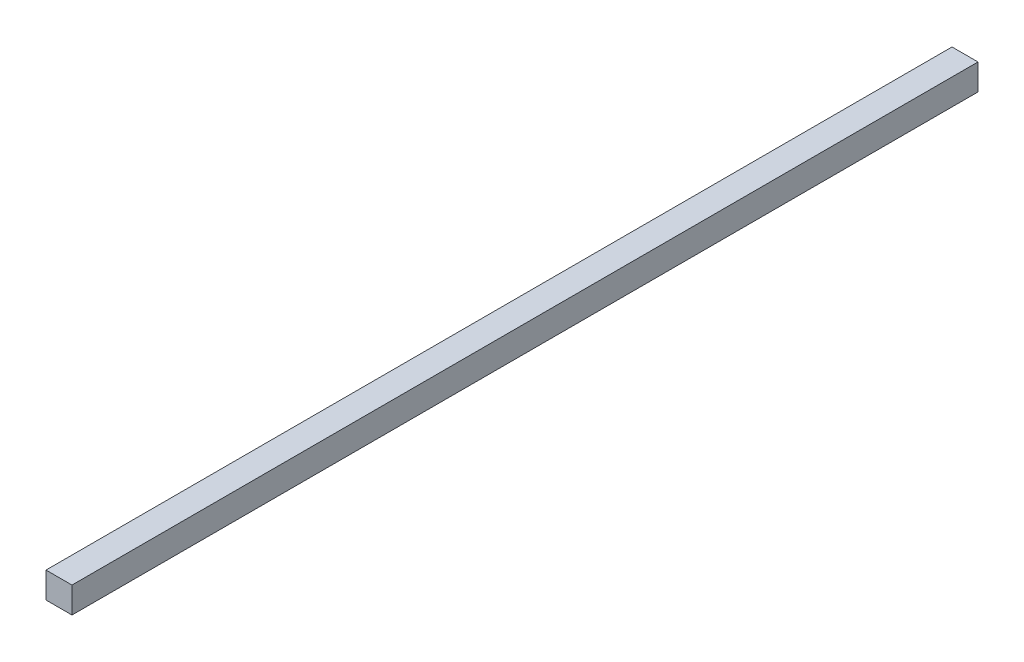
ISO-10303-21;
HEADER;
FILE_DESCRIPTION(('STEP AP214'),'2;1');
FILE_NAME('part.step','',(''),(''),'','','');
FILE_SCHEMA(('AUTOMOTIVE_DESIGN { 1 0 10303 214 1 1 1 1 }'));
ENDSEC;
DATA;
#1=APPLICATION_CONTEXT('core data for automotive mechanical design processes');
#2=APPLICATION_PROTOCOL_DEFINITION('international standard','automotive_design',2000,#1);
#3=PRODUCT_CONTEXT('',#1,'mechanical');
#4=PRODUCT('Part','Part','',(#3));
#5=PRODUCT_RELATED_PRODUCT_CATEGORY('part','',(#4));
#6=PRODUCT_DEFINITION_FORMATION('','',#4);
#7=PRODUCT_DEFINITION_CONTEXT('part definition',#1,'design');
#8=PRODUCT_DEFINITION('design','',#6,#7);
#9=PRODUCT_DEFINITION_SHAPE('','',#8);
#10=(LENGTH_UNIT() NAMED_UNIT(*) SI_UNIT(.MILLI.,.METRE.));
#11=(NAMED_UNIT(*) PLANE_ANGLE_UNIT() SI_UNIT($,.RADIAN.));
#12=(NAMED_UNIT(*) SI_UNIT($,.STERADIAN.) SOLID_ANGLE_UNIT());
#13=UNCERTAINTY_MEASURE_WITH_UNIT(LENGTH_MEASURE(1.E-05),#10,'distance_accuracy_value','');
#14=(GEOMETRIC_REPRESENTATION_CONTEXT(3) GLOBAL_UNCERTAINTY_ASSIGNED_CONTEXT((#13)) GLOBAL_UNIT_ASSIGNED_CONTEXT((#10,
#11,#12)) REPRESENTATION_CONTEXT('',''));
#15=CARTESIAN_POINT('',(0.,0.,0.));
#16=DIRECTION('',(0.,0.,1.));
#17=DIRECTION('',(1.,0.,0.));
#18=AXIS2_PLACEMENT_3D('',#15,#16,#17);
#19=CARTESIAN_POINT('',(1.43379802499999,-1.433798025,100.));
#20=DIRECTION('',(-1.,0.,0.));
#21=DIRECTION('',(0.,0.,1.));
#22=AXIS2_PLACEMENT_3D('',#19,#20,#21);
#23=PLANE('',#22);
#24=DIRECTION('',(0.,1.,0.));
#25=VECTOR('',#24,1.);
#26=CARTESIAN_POINT('',(1.43379802499999,-1.433798025,0.));
#27=LINE('',#26,#25);
#28=CARTESIAN_POINT('',(1.43379802499999,-1.433798025,0.));
#29=VERTEX_POINT('',#28);
#30=CARTESIAN_POINT('',(1.43379802499999,1.433798025,0.));
#31=VERTEX_POINT('',#30);
#32=EDGE_CURVE('E100',#29,#31,#27,.T.);
#33=ORIENTED_EDGE('',*,*,#32,.T.);
#34=DIRECTION('',(0.,0.,-1.));
#35=VECTOR('',#34,1.);
#36=CARTESIAN_POINT('',(1.43379802499999,1.433798025,100.));
#37=LINE('',#36,#35);
#38=CARTESIAN_POINT('',(1.43379802499999,1.433798025,100.));
#39=VERTEX_POINT('',#38);
#40=EDGE_CURVE('E11',#39,#31,#37,.T.);
#41=ORIENTED_EDGE('',*,*,#40,.F.);
#42=DIRECTION('',(0.,1.,0.));
#43=VECTOR('',#42,1.);
#44=CARTESIAN_POINT('',(1.43379802499999,-1.433798025,100.));
#45=LINE('',#44,#43);
#46=CARTESIAN_POINT('',(1.43379802499999,-1.433798025,100.));
#47=VERTEX_POINT('',#46);
#48=EDGE_CURVE('E88',#47,#39,#45,.T.);
#49=ORIENTED_EDGE('',*,*,#48,.F.);
#50=DIRECTION('',(0.,0.,-1.));
#51=VECTOR('',#50,1.);
#52=CARTESIAN_POINT('',(1.43379802499999,-1.433798025,100.));
#53=LINE('',#52,#51);
#54=EDGE_CURVE('E96',#47,#29,#53,.T.);
#55=ORIENTED_EDGE('',*,*,#54,.T.);
#56=EDGE_LOOP('',(#33,#41,#49,#55));
#57=FACE_BOUND('',#56,.T.);
#58=ADVANCED_FACE('F37',(#57),#23,.F.);
#59=CARTESIAN_POINT('',(-1.43379802499999,1.433798025,100.));
#60=DIRECTION('',(0.,-1.,0.));
#61=DIRECTION('',(0.,0.,-1.));
#62=AXIS2_PLACEMENT_3D('',#59,#60,#61);
#63=PLANE('',#62);
#64=DIRECTION('',(-1.,0.,0.));
#65=VECTOR('',#64,1.);
#66=CARTESIAN_POINT('',(-1.43379802499999,1.433798025,0.));
#67=LINE('',#66,#65);
#68=CARTESIAN_POINT('',(-1.43379802499999,1.433798025,0.));
#69=VERTEX_POINT('',#68);
#70=EDGE_CURVE('E92',#31,#69,#67,.T.);
#71=ORIENTED_EDGE('',*,*,#70,.T.);
#72=DIRECTION('',(0.,0.,-1.));
#73=VECTOR('',#72,1.);
#74=CARTESIAN_POINT('',(-1.43379802499999,1.433798025,100.));
#75=LINE('',#74,#73);
#76=CARTESIAN_POINT('',(-1.43379802499999,1.433798025,100.));
#77=VERTEX_POINT('',#76);
#78=EDGE_CURVE('E45',#77,#69,#75,.T.);
#79=ORIENTED_EDGE('',*,*,#78,.F.);
#80=DIRECTION('',(-1.,0.,0.));
#81=VECTOR('',#80,1.);
#82=CARTESIAN_POINT('',(-1.43379802499999,1.433798025,100.));
#83=LINE('',#82,#81);
#84=EDGE_CURVE('E83',#39,#77,#83,.T.);
#85=ORIENTED_EDGE('',*,*,#84,.F.);
#86=ORIENTED_EDGE('',*,*,#40,.T.);
#87=EDGE_LOOP('',(#71,#79,#85,#86));
#88=FACE_BOUND('',#87,.T.);
#89=ADVANCED_FACE('F91',(#88),#63,.F.);
#90=CARTESIAN_POINT('',(-1.43379802499999,-1.433798025,100.));
#91=DIRECTION('',(1.,0.,0.));
#92=DIRECTION('',(0.,0.,-1.));
#93=AXIS2_PLACEMENT_3D('',#90,#91,#92);
#94=PLANE('',#93);
#95=DIRECTION('',(0.,-1.,0.));
#96=VECTOR('',#95,1.);
#97=CARTESIAN_POINT('',(-1.43379802499999,-1.433798025,0.));
#98=LINE('',#97,#96);
#99=CARTESIAN_POINT('',(-1.43379802499999,-1.433798025,0.));
#100=VERTEX_POINT('',#99);
#101=EDGE_CURVE('E70',#69,#100,#98,.T.);
#102=ORIENTED_EDGE('',*,*,#101,.T.);
#103=DIRECTION('',(0.,0.,-1.));
#104=VECTOR('',#103,1.);
#105=CARTESIAN_POINT('',(-1.43379802499999,-1.433798025,100.));
#106=LINE('',#105,#104);
#107=CARTESIAN_POINT('',(-1.43379802499999,-1.433798025,100.));
#108=VERTEX_POINT('',#107);
#109=EDGE_CURVE('E93',#108,#100,#106,.T.);
#110=ORIENTED_EDGE('',*,*,#109,.F.);
#111=DIRECTION('',(0.,-1.,0.));
#112=VECTOR('',#111,1.);
#113=CARTESIAN_POINT('',(-1.43379802499999,-1.433798025,100.));
#114=LINE('',#113,#112);
#115=EDGE_CURVE('E86',#77,#108,#114,.T.);
#116=ORIENTED_EDGE('',*,*,#115,.F.);
#117=ORIENTED_EDGE('',*,*,#78,.T.);
#118=EDGE_LOOP('',(#102,#110,#116,#117));
#119=FACE_BOUND('',#118,.T.);
#120=ADVANCED_FACE('F94',(#119),#94,.F.);
#121=CARTESIAN_POINT('',(-1.43379802499999,-1.433798025,100.));
#122=DIRECTION('',(0.,1.,0.));
#123=DIRECTION('',(0.,0.,1.));
#124=AXIS2_PLACEMENT_3D('',#121,#122,#123);
#125=PLANE('',#124);
#126=DIRECTION('',(1.,0.,0.));
#127=VECTOR('',#126,1.);
#128=CARTESIAN_POINT('',(-1.43379802499999,-1.433798025,0.));
#129=LINE('',#128,#127);
#130=EDGE_CURVE('E76',#100,#29,#129,.T.);
#131=ORIENTED_EDGE('',*,*,#130,.T.);
#132=ORIENTED_EDGE('',*,*,#54,.F.);
#133=DIRECTION('',(1.,0.,0.));
#134=VECTOR('',#133,1.);
#135=CARTESIAN_POINT('',(-1.43379802499999,-1.433798025,100.));
#136=LINE('',#135,#134);
#137=EDGE_CURVE('E53',#108,#47,#136,.T.);
#138=ORIENTED_EDGE('',*,*,#137,.F.);
#139=ORIENTED_EDGE('',*,*,#109,.T.);
#140=EDGE_LOOP('',(#131,#132,#138,#139));
#141=FACE_BOUND('',#140,.T.);
#142=ADVANCED_FACE('F107',(#141),#125,.F.);
#143=CARTESIAN_POINT('',(0.,0.,100.));
#144=DIRECTION('',(0.,0.,-1.));
#145=DIRECTION('',(-1.,0.,0.));
#146=AXIS2_PLACEMENT_3D('',#143,#144,#145);
#147=PLANE('',#146);
#148=ORIENTED_EDGE('',*,*,#48,.T.);
#149=ORIENTED_EDGE('',*,*,#84,.T.);
#150=ORIENTED_EDGE('',*,*,#115,.T.);
#151=ORIENTED_EDGE('',*,*,#137,.T.);
#152=EDGE_LOOP('',(#148,#149,#150,#151));
#153=FACE_BOUND('',#152,.T.);
#154=ADVANCED_FACE('F84',(#153),#147,.F.);
#155=CARTESIAN_POINT('',(0.,0.,0.));
#156=DIRECTION('',(0.,0.,-1.));
#157=DIRECTION('',(-1.,0.,0.));
#158=AXIS2_PLACEMENT_3D('',#155,#156,#157);
#159=PLANE('',#158);
#160=ORIENTED_EDGE('',*,*,#32,.F.);
#161=ORIENTED_EDGE('',*,*,#130,.F.);
#162=ORIENTED_EDGE('',*,*,#101,.F.);
#163=ORIENTED_EDGE('',*,*,#70,.F.);
#164=EDGE_LOOP('',(#160,#161,#162,#163));
#165=FACE_BOUND('',#164,.T.);
#166=ADVANCED_FACE('F110',(#165),#159,.T.);
#167=CLOSED_SHELL('',(#58,#89,#120,#142,#154,#166));
#168=MANIFOLD_SOLID_BREP('B2',#167);
#169=ADVANCED_BREP_SHAPE_REPRESENTATION('',(#18,#168),#14);
#170=SHAPE_DEFINITION_REPRESENTATION(#9,#169);
ENDSEC;
END-ISO-10303-21;
